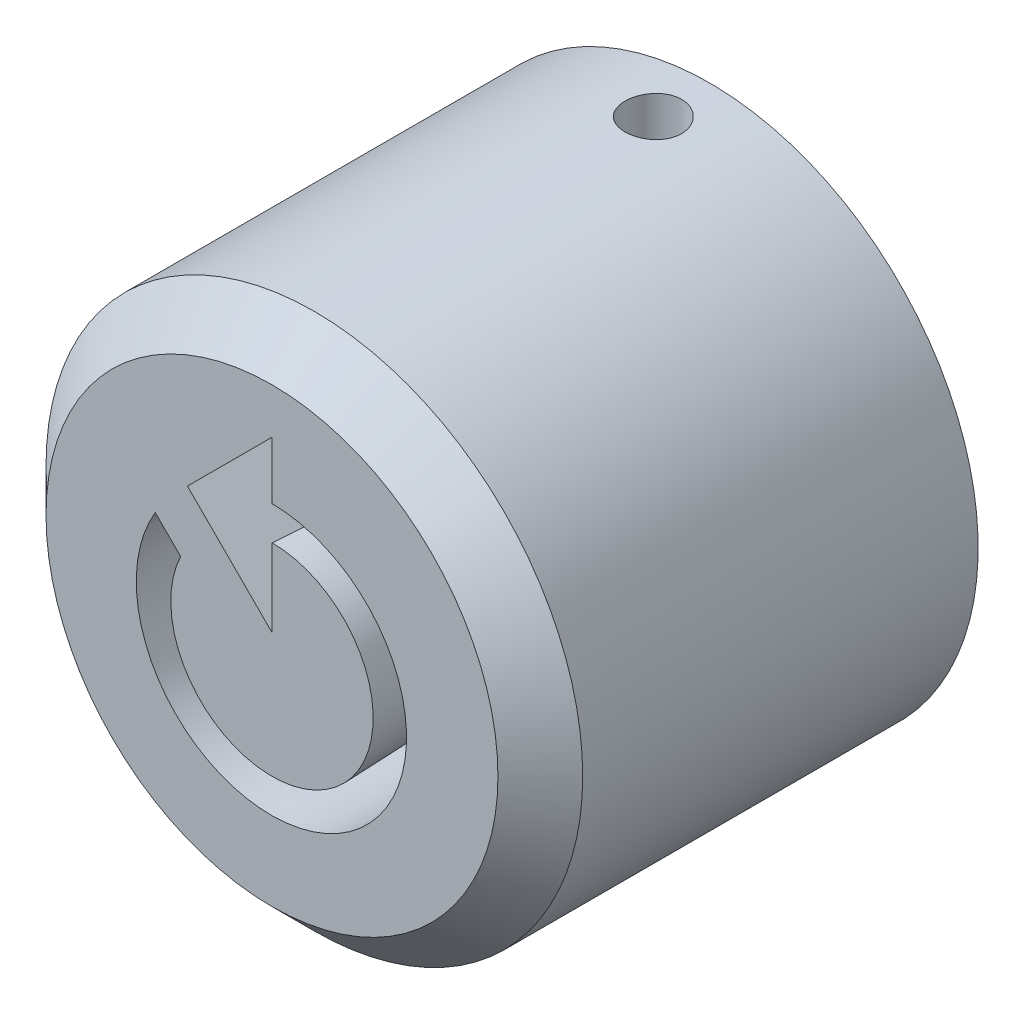
ISO-10303-21;
HEADER;
FILE_DESCRIPTION(('STEP AP214'),'2;1');
FILE_NAME('part.step','',(''),(''),'','','');
FILE_SCHEMA(('AUTOMOTIVE_DESIGN { 1 0 10303 214 1 1 1 1 }'));
ENDSEC;
DATA;
#1=APPLICATION_CONTEXT('core data for automotive mechanical design processes');
#2=APPLICATION_PROTOCOL_DEFINITION('international standard','automotive_design',2000,#1);
#3=PRODUCT_CONTEXT('',#1,'mechanical');
#4=PRODUCT('Part','Part','',(#3));
#5=PRODUCT_RELATED_PRODUCT_CATEGORY('part','',(#4));
#6=PRODUCT_DEFINITION_FORMATION('','',#4);
#7=PRODUCT_DEFINITION_CONTEXT('part definition',#1,'design');
#8=PRODUCT_DEFINITION('design','',#6,#7);
#9=PRODUCT_DEFINITION_SHAPE('','',#8);
#10=(LENGTH_UNIT() NAMED_UNIT(*) SI_UNIT(.MILLI.,.METRE.));
#11=(NAMED_UNIT(*) PLANE_ANGLE_UNIT() SI_UNIT($,.RADIAN.));
#12=(NAMED_UNIT(*) SI_UNIT($,.STERADIAN.) SOLID_ANGLE_UNIT());
#13=UNCERTAINTY_MEASURE_WITH_UNIT(LENGTH_MEASURE(1.E-05),#10,'distance_accuracy_value','');
#14=(GEOMETRIC_REPRESENTATION_CONTEXT(3) GLOBAL_UNCERTAINTY_ASSIGNED_CONTEXT((#13)) GLOBAL_UNIT_ASSIGNED_CONTEXT((#10,
#11,#12)) REPRESENTATION_CONTEXT('',''));
#15=CARTESIAN_POINT('',(0.,0.,0.));
#16=DIRECTION('',(0.,0.,1.));
#17=DIRECTION('',(1.,0.,0.));
#18=AXIS2_PLACEMENT_3D('',#15,#16,#17);
#19=CARTESIAN_POINT('',(-0.52868972236023,-0.528935712543339,7.75));
#20=DIRECTION('',(-0.706511647901726,-0.706840375551015,-0.0348994967025009));
#21=DIRECTION('',(0.707271226072109,-0.706942298048756,0.));
#22=AXIS2_PLACEMENT_3D('',#19,#20,#21);
#23=PLANE('',#22);
#24=CARTESIAN_POINT('',(-2.06629508801716,1.00795456465108,7.75));
#25=CARTESIAN_POINT('',(-2.09192062760297,1.21234922911868,4.12904064150296));
#26=CARTESIAN_POINT('',(-2.10500318028833,1.42929271652146,0.));
#27=B_SPLINE_CURVE_WITH_KNOTS('',2,(#24,#25,#26),.UNSPECIFIED.,.F.,.F.,(3,3),(0.,1.),.UNSPECIFIED.);
#28=CARTESIAN_POINT('',(-2.06629508801841,1.00795456465234,7.74999999999363));
#29=VERTEX_POINT('',#28);
#30=CARTESIAN_POINT('',(-2.10500318029031,1.42929271652343,0.));
#31=VERTEX_POINT('',#30);
#32=EDGE_CURVE('E124',#29,#31,#27,.T.);
#33=ORIENTED_EDGE('',*,*,#32,.T.);
#34=DIRECTION('',(0.707271226072109,-0.706942298048756,0.));
#35=VECTOR('',#34,1.);
#36=CARTESIAN_POINT('',(-0.337365712345746,-0.337522682776313,0.));
#37=LINE('',#36,#35);
#38=CARTESIAN_POINT('',(-1.28116608095946,0.605838756077155,0.));
#39=VERTEX_POINT('',#38);
#40=EDGE_CURVE('E110',#31,#39,#37,.T.);
#41=ORIENTED_EDGE('',*,*,#40,.T.);
#42=CARTESIAN_POINT('',(-1.6164705882346,0.558339263091638,7.74999999999492));
#43=CARTESIAN_POINT('',(-1.59218208177448,0.562516200801567,7.17370111765858));
#44=CARTESIAN_POINT('',(-1.56776740878335,0.566566813974001,6.59740662391816));
#45=CARTESIAN_POINT('',(-1.5186633573595,0.574392959084058,5.44482783512599));
#46=CARTESIAN_POINT('',(-1.49397397909784,0.578168491192965,4.86854354006811));
#47=CARTESIAN_POINT('',(-1.43830209697928,0.586297572042159,3.57686887432792));
#48=CARTESIAN_POINT('',(-1.40723921232807,0.590570631736887,2.86148145325106));
#49=CARTESIAN_POINT('',(-1.34460080538816,0.598603412829164,1.43072563064751));
#50=CARTESIAN_POINT('',(-1.31302528270274,0.602363133829417,0.715357229135969));
#51=CARTESIAN_POINT('',(-1.28116608095946,0.605838756077157,0.));
#52=B_SPLINE_CURVE_WITH_KNOTS('',3,(#42,#43,#44,#45,#46,#47,#48,#49,#50,#51),.UNSPECIFIED.,.F.,
.F.,(4,2,2,2,4),(0.,1.7304768057952,3.46095253407857,5.60917490813668,7.75739894479559),.UNSPECIFIED.);
#53=CARTESIAN_POINT('',(-1.61647058823465,0.558339263091434,7.74999999999363));
#54=VERTEX_POINT('',#53);
#55=EDGE_CURVE('E103',#54,#39,#52,.T.);
#56=ORIENTED_EDGE('',*,*,#55,.F.);
#57=DIRECTION('',(0.707271226072109,-0.706942298048756,0.));
#58=VECTOR('',#57,1.);
#59=CARTESIAN_POINT('',(-0.52868972236023,-0.528935712543339,7.75));
#60=LINE('',#59,#58);
#61=EDGE_CURVE('E135',#54,#29,#60,.F.);
#62=ORIENTED_EDGE('',*,*,#61,.T.);
#63=EDGE_LOOP('',(#33,#41,#56,#62));
#64=FACE_BOUND('',#63,.T.);
#65=ADVANCED_FACE('F17',(#64),#23,.T.);
#66=CARTESIAN_POINT('',(0.,19.0707581171369,1.));
#67=DIRECTION('',(0.,-1.,0.));
#68=DIRECTION('',(0.,0.,-1.));
#69=AXIS2_PLACEMENT_3D('',#66,#67,#68);
#70=CYLINDRICAL_SURFACE('',#69,0.5);
#71=CARTESIAN_POINT('',(0.,0.,1.));
#72=DIRECTION('',(0.,-1.,0.));
#73=DIRECTION('',(0.,0.,-1.));
#74=AXIS2_PLACEMENT_3D('',#71,#72,#73);
#75=CIRCLE('',#74,0.5);
#76=CARTESIAN_POINT('',(0.254278491846928,0.,0.5694858323074));
#77=VERTEX_POINT('',#76);
#78=CARTESIAN_POINT('',(0.223627931985657,0.,1.44720302775793));
#79=VERTEX_POINT('',#78);
#80=EDGE_CURVE('E21',#77,#79,#75,.T.);
#81=ORIENTED_EDGE('',*,*,#80,.T.);
#82=DIRECTION('',(0.,1.,0.));
#83=VECTOR('',#82,1.);
#84=CARTESIAN_POINT('',(0.223627931985655,0.,1.44720302775797));
#85=LINE('',#84,#83);
#86=CARTESIAN_POINT('',(0.223627931986733,1.34224395970398,1.44720302775771));
#87=VERTEX_POINT('',#86);
#88=EDGE_CURVE('E113',#87,#79,#85,.F.);
#89=ORIENTED_EDGE('',*,*,#88,.F.);
#90=CARTESIAN_POINT('',(0.254278491849068,1.30645754482282,0.569485832308664));
#91=CARTESIAN_POINT('',(0.278667429265234,1.30289349994388,0.583872700750701));
#92=CARTESIAN_POINT('',(0.301772155658622,1.29899898522769,0.600329868723842));
#93=CARTESIAN_POINT('',(0.344884978732647,1.29105372198719,0.636889333162118));
#94=CARTESIAN_POINT('',(0.364891319343464,1.28700288647784,0.656993682824281));
#95=CARTESIAN_POINT('',(0.401259920447106,1.27925282867018,0.70034600321787));
#96=CARTESIAN_POINT('',(0.417620266203169,1.27555379170474,0.723595615469751));
#97=CARTESIAN_POINT('',(0.446203867584063,1.26902198368975,0.772610907936497));
#98=CARTESIAN_POINT('',(0.458429677670819,1.26618867786575,0.79837502187621));
#99=CARTESIAN_POINT('',(0.478185683498803,1.26185994633733,0.851265318158901));
#100=CARTESIAN_POINT('',(0.485790426341684,1.26034310160132,0.878361806708653));
#101=CARTESIAN_POINT('',(0.496350072133742,1.25885046392663,0.93348920603784));
#102=CARTESIAN_POINT('',(0.499305664134467,1.25887444260018,0.961519977718002));
#103=CARTESIAN_POINT('',(0.500451402088437,1.26050923112215,1.01640610812182));
#104=CARTESIAN_POINT('',(0.498843064849056,1.26205103447842,1.04325960853596));
#105=CARTESIAN_POINT('',(0.491377990007465,1.26650510510505,1.09624760463344));
#106=CARTESIAN_POINT('',(0.485521409013351,1.26941732185484,1.12238212678447));
#107=CARTESIAN_POINT('',(0.469740961979443,1.27636188238411,1.17337761447969));
#108=CARTESIAN_POINT('',(0.459796469372507,1.28039987279,1.19823139138769));
#109=CARTESIAN_POINT('',(0.436142319225752,1.28921546521452,1.24594614915328));
#110=CARTESIAN_POINT('',(0.422430494953527,1.29399349216363,1.26880597321612));
#111=CARTESIAN_POINT('',(0.390792743382608,1.30411655184093,1.31314756525043));
#112=CARTESIAN_POINT('',(0.372684264791615,1.30947816138169,1.33449519367615));
#113=CARTESIAN_POINT('',(0.333150236057103,1.32002372691148,1.37388158549519));
#114=CARTESIAN_POINT('',(0.311728782970256,1.32520789279698,1.39192437648137));
#115=CARTESIAN_POINT('',(0.278572898755345,1.33225268917277,1.41540170779116));
#116=CARTESIAN_POINT('',(0.267934822717999,1.33438259103107,1.42234182344411));
#117=CARTESIAN_POINT('',(0.246152368491054,1.33845936386926,1.43539610906682));
#118=CARTESIAN_POINT('',(0.235008773151065,1.3404065044262,1.44151150153307));
#119=CARTESIAN_POINT('',(0.223627931987809,1.34224395970479,1.44720302775745));
#120=B_SPLINE_CURVE_WITH_KNOTS('',3,(#90,#91,#92,#93,#94,#95,#96,#97,#98,#99,#100,#101,#102,
#103,#104,#105,#106,#107,#108,#109,#110,#111,#112,#113,#114,#115,#116,#117,#118,#119),
.UNSPECIFIED.,.F.,.F.,(4,2,2,2,2,2,2,2,2,2,2,2,2,2,4),(0.,0.0855006247958221,0.171049532759484,
0.256643262410861,0.342184012209441,0.426305406751942,0.510414332471131,0.590868015605615,
0.671318733030357,0.752180466658459,0.83308880457947,0.918218744766181,1.00324423692253,
1.04184958772311,1.08039706918053),.UNSPECIFIED.);
#121=CARTESIAN_POINT('',(0.254278491847923,1.30645754482306,0.569485832310194));
#122=VERTEX_POINT('',#121);
#123=EDGE_CURVE('E97',#122,#87,#120,.T.);
#124=ORIENTED_EDGE('',*,*,#123,.F.);
#125=DIRECTION('',(0.,1.,0.));
#126=VECTOR('',#125,1.);
#127=CARTESIAN_POINT('',(0.254278491846928,0.,0.5694858323074));
#128=LINE('',#127,#126);
#129=EDGE_CURVE('E92',#77,#122,#128,.T.);
#130=ORIENTED_EDGE('',*,*,#129,.F.);
#131=EDGE_LOOP('',(#81,#89,#124,#130));
#132=FACE_BOUND('',#131,.T.);
#133=ADVANCED_FACE('F94',(#132),#70,.F.);
#134=CARTESIAN_POINT('',(0.,0.,1.));
#135=DIRECTION('',(0.,-1.,0.));
#136=DIRECTION('',(0.,0.,-1.));
#137=AXIS2_PLACEMENT_3D('',#134,#135,#136);
#138=PLANE('',#137);
#139=ORIENTED_EDGE('',*,*,#80,.F.);
#140=DIRECTION('',(-0.0348994967025009,0.,0.999390827019096));
#141=VECTOR('',#140,1.);
#142=CARTESIAN_POINT('',(0.00352941176470608,0.,7.75));
#143=LINE('',#142,#141);
#144=EDGE_CURVE('E107',#79,#77,#143,.F.);
#145=ORIENTED_EDGE('',*,*,#144,.F.);
#146=EDGE_LOOP('',(#139,#145));
#147=FACE_BOUND('',#146,.T.);
#148=ADVANCED_FACE('F106',(#147),#138,.F.);
#149=CARTESIAN_POINT('',(0.,19.0707581171369,1.));
#150=DIRECTION('',(0.,-1.,0.));
#151=DIRECTION('',(0.,0.,-1.));
#152=AXIS2_PLACEMENT_3D('',#149,#150,#151);
#153=CYLINDRICAL_SURFACE('',#152,0.5);
#154=CARTESIAN_POINT('',(0.,0.,1.));
#155=DIRECTION('',(0.,-1.,0.));
#156=DIRECTION('',(0.,0.,-1.));
#157=AXIS2_PLACEMENT_3D('',#154,#155,#156);
#158=CIRCLE('',#157,0.5);
#159=CARTESIAN_POINT('',(-0.107356942752589,0.,1.48833849617127));
#160=VERTEX_POINT('',#159);
#161=CARTESIAN_POINT('',(-0.154955734579308,0.,0.524617290679407));
#162=VERTEX_POINT('',#161);
#163=EDGE_CURVE('E109',#160,#162,#158,.T.);
#164=ORIENTED_EDGE('',*,*,#163,.T.);
#165=CARTESIAN_POINT('',(0.,-0.131448614777572,1.));
#166=DIRECTION('',(0.706601654000678,0.706750399853738,-0.0348994967025009));
#167=DIRECTION('',(0.705889938423281,-0.707462982993868,-0.0348643446259301));
#168=AXIS2_PLACEMENT_3D('',#165,#166,#167);
#169=ELLIPSE('',#168,0.707463342225876,0.5);
#170=EDGE_CURVE('E114',#160,#162,#169,.F.);
#171=ORIENTED_EDGE('',*,*,#170,.F.);
#172=EDGE_LOOP('',(#164,#171));
#173=FACE_BOUND('',#172,.T.);
#174=ADVANCED_FACE('F435',(#173),#153,.F.);
#175=CARTESIAN_POINT('',(0.,0.,1.));
#176=DIRECTION('',(0.,-1.,0.));
#177=DIRECTION('',(0.,0.,-1.));
#178=AXIS2_PLACEMENT_3D('',#175,#176,#177);
#179=PLANE('',#178);
#180=ORIENTED_EDGE('',*,*,#163,.F.);
#181=DIRECTION('',(0.0493304915471502,0.,0.998782510161104));
#182=VECTOR('',#181,1.);
#183=CARTESIAN_POINT('',(-0.154955734579307,0.,0.524617290679409));
#184=LINE('',#183,#182);
#185=EDGE_CURVE('E117',#162,#160,#184,.T.);
#186=ORIENTED_EDGE('',*,*,#185,.F.);
#187=EDGE_LOOP('',(#180,#186));
#188=FACE_BOUND('',#187,.T.);
#189=ADVANCED_FACE('F427',(#188),#179,.F.);
#190=CARTESIAN_POINT('',(0.00334204702841537,0.,7.75));
#191=DIRECTION('',(-0.999390827019096,0.,-0.0348994967025009));
#192=DIRECTION('',(-0.0348994967025009,0.,0.999390827019096));
#193=AXIS2_PLACEMENT_3D('',#190,#191,#192);
#194=PLANE('',#193);
#195=CARTESIAN_POINT('',(0.223437239058528,2.38741244755919,1.44729833467374));
#196=CARTESIAN_POINT('',(0.108768641537139,2.28258517635298,4.73097733689296));
#197=CARTESIAN_POINT('',(0.00334204702841585,2.17775790514684,7.75));
#198=B_SPLINE_CURVE_WITH_KNOTS('',2,(#195,#196,#197),.UNSPECIFIED.,.F.,.F.,(3,3),(0.,1.),.UNSPECIFIED.);
#199=CARTESIAN_POINT('',(0.223437239060292,2.3874124475616,1.44729833467286));
#200=VERTEX_POINT('',#199);
#201=CARTESIAN_POINT('',(0.00334204702841597,2.17775790514856,7.74999999999363));
#202=VERTEX_POINT('',#201);
#203=EDGE_CURVE('E160',#200,#202,#198,.T.);
#204=ORIENTED_EDGE('',*,*,#203,.T.);
#205=DIRECTION('',(0.,1.,0.));
#206=VECTOR('',#205,1.);
#207=CARTESIAN_POINT('',(0.00334204702841608,0.,7.75));
#208=LINE('',#207,#206);
#209=CARTESIAN_POINT('',(0.00334204702841679,3.19775790514684,7.75));
#210=VERTEX_POINT('',#209);
#211=EDGE_CURVE('E245',#210,#202,#208,.F.);
#212=ORIENTED_EDGE('',*,*,#211,.F.);
#213=DIRECTION('',(-0.0347762787171803,-0.0839573637278828,0.995862325582432));
#214=VECTOR('',#213,1.);
#215=CARTESIAN_POINT('',(0.223437239058533,3.72911470275905,1.44729833467374));
#216=LINE('',#215,#214);
#217=CARTESIAN_POINT('',(0.223437239058531,3.72911470275905,1.44729833467374));
#218=VERTEX_POINT('',#217);
#219=EDGE_CURVE('E189',#218,#210,#216,.T.);
#220=ORIENTED_EDGE('',*,*,#219,.F.);
#221=DIRECTION('',(0.,1.,0.));
#222=VECTOR('',#221,1.);
#223=CARTESIAN_POINT('',(0.223437239058528,0.,1.44729833467374));
#224=LINE('',#223,#222);
#225=EDGE_CURVE('E36',#218,#200,#224,.F.);
#226=ORIENTED_EDGE('',*,*,#225,.T.);
#227=EDGE_LOOP('',(#204,#212,#220,#226));
#228=FACE_BOUND('',#227,.T.);
#229=ADVANCED_FACE('F172',(#228),#194,.T.);
#230=CARTESIAN_POINT('',(-0.0102924476809878,-0.213841015526033,5.6843418860808E-11));
#231=DIRECTION('',(0.,0.,-1.));
#232=DIRECTION('',(-1.,0.,0.));
#233=AXIS2_PLACEMENT_3D('',#230,#231,#232);
#234=CONICAL_SURFACE('',#233,2.66227374901825,0.0349065850402135);
#235=CARTESIAN_POINT('',(0.254094871444858,2.4152895818073,0.569377431727712));
#236=CARTESIAN_POINT('',(0.278506549375255,2.41233487672303,0.583759045956063));
#237=CARTESIAN_POINT('',(0.301637412372597,2.40908084648447,0.60022528988083));
#238=CARTESIAN_POINT('',(0.34476969580144,2.40230022080723,0.63678201318293));
#239=CARTESIAN_POINT('',(0.364772537812557,2.39877375027849,0.656870837230129));
#240=CARTESIAN_POINT('',(0.401109341438213,2.39177006012126,0.70014786605757));
#241=CARTESIAN_POINT('',(0.417442270415014,2.38829285461216,0.723336940263912));
#242=CARTESIAN_POINT('',(0.445975918159442,2.3817101197951,0.772174177877493));
#243=CARTESIAN_POINT('',(0.45817759533091,2.37860450439067,0.797821769162531));
#244=CARTESIAN_POINT('',(0.478064597125857,2.37304869609541,0.850822911786097));
#245=CARTESIAN_POINT('',(0.485758818210882,2.37059721736705,0.878172983998591));
#246=CARTESIAN_POINT('',(0.49641359688084,2.36654838480566,0.933844710883128));
#247=CARTESIAN_POINT('',(0.499374163070338,2.36495102942006,0.962166363788991));
#248=CARTESIAN_POINT('',(0.500436892292441,2.36273927892716,1.01838748694821));
#249=CARTESIAN_POINT('',(0.498632161127439,2.36210642197446,1.04628449311119));
#250=CARTESIAN_POINT('',(0.490403731227223,2.36175799553987,1.10139083885165));
#251=CARTESIAN_POINT('',(0.483980686985098,2.36204229610114,1.12860027530387));
#252=CARTESIAN_POINT('',(0.466783966200434,2.36341010874136,1.1813136367311));
#253=CARTESIAN_POINT('',(0.456049729593966,2.36448644739593,1.20683064301765));
#254=CARTESIAN_POINT('',(0.430537732376435,2.36723803460051,1.25573035009747));
#255=CARTESIAN_POINT('',(0.415758504879026,2.36891350048734,1.27911227250794));
#256=CARTESIAN_POINT('',(0.3823688489163,2.37263808689404,1.32337660827142));
#257=CARTESIAN_POINT('',(0.363713833083126,2.37469152107846,1.34422500634758));
#258=CARTESIAN_POINT('',(0.323218740410589,2.3788708430051,1.38249615377422));
#259=CARTESIAN_POINT('',(0.301382807562521,2.38099663376367,1.39992329191739));
#260=CARTESIAN_POINT('',(0.260682955533773,2.38456354219102,1.42719489021343));
#261=CARTESIAN_POINT('',(0.242364795882774,2.3860464780115,1.43785525475898));
#262=CARTESIAN_POINT('',(0.223437239062062,2.38741244756402,1.44729833467199));
#263=B_SPLINE_CURVE_WITH_KNOTS('',3,(#235,#236,#237,#238,#239,#240,#241,#242,#243,#244,#245,
#246,#247,#248,#249,#250,#251,#252,#253,#254,#255,#256,#257,#258,#259,#260,#261,#262),
.UNSPECIFIED.,.F.,.F.,(4,2,2,2,2,2,2,2,2,2,2,2,2,4),(0.,0.0853383907859752,0.170637884739307,
0.255961350235532,0.341265008065434,0.426399728016077,0.511534293213514,0.595017839754961,
0.678489557596875,0.761214441421077,0.843969364659401,0.927735005757518,1.01139247987899,
1.07495776173753),.UNSPECIFIED.);
#264=CARTESIAN_POINT('',(0.254094891970935,2.41528957972043,0.569377432376052));
#265=VERTEX_POINT('',#264);
#266=EDGE_CURVE('E128',#265,#200,#263,.T.);
#267=ORIENTED_EDGE('',*,*,#266,.F.);
#268=CARTESIAN_POINT('',(0.273978010589455,2.4332124069188,1.35185307175451E-13));
#269=CARTESIAN_POINT('',(0.270664149778012,2.43023540574384,0.0948965575409736));
#270=CARTESIAN_POINT('',(0.26735029453127,2.42725333604928,0.189792955729574));
#271=CARTESIAN_POINT('',(0.260722595167123,2.42127905962086,0.379585433404326));
#272=CARTESIAN_POINT('',(0.257408751049716,2.41828685288701,0.474481512890478));
#273=CARTESIAN_POINT('',(0.254094912497012,2.41528957763355,0.569377433024392));
#274=B_SPLINE_CURVE_WITH_KNOTS('',3,(#268,#269,#270,#271,#272,#273),.UNSPECIFIED.,.F.,.F.,(4,2,
4),(0.,0.285003169962829,0.570006339931746),.UNSPECIFIED.);
#275=CARTESIAN_POINT('',(0.273978010589458,2.43321240691881,0.));
#276=VERTEX_POINT('',#275);
#277=EDGE_CURVE('E180',#276,#265,#274,.T.);
#278=ORIENTED_EDGE('',*,*,#277,.F.);
#279=CARTESIAN_POINT('',(-0.0102924476809878,-0.213841015526033,0.));
#280=DIRECTION('',(0.,0.,-1.));
#281=DIRECTION('',(-1.,0.,0.));
#282=AXIS2_PLACEMENT_3D('',#279,#280,#281);
#283=CIRCLE('',#282,2.66227374902023);
#284=EDGE_CURVE('E191',#276,#31,#283,.T.);
#285=ORIENTED_EDGE('',*,*,#284,.T.);
#286=ORIENTED_EDGE('',*,*,#32,.F.);
#287=CARTESIAN_POINT('',(-0.0102924476809878,-0.213841015526033,7.74999999998727));
#288=DIRECTION('',(0.,0.,-1.));
#289=DIRECTION('',(-1.,0.,0.));
#290=AXIS2_PLACEMENT_3D('',#287,#288,#289);
#291=CIRCLE('',#290,2.39163778545709);
#292=EDGE_CURVE('E272',#202,#29,#291,.T.);
#293=ORIENTED_EDGE('',*,*,#292,.F.);
#294=ORIENTED_EDGE('',*,*,#203,.F.);
#295=EDGE_LOOP('',(#267,#278,#285,#286,#293,#294));
#296=FACE_BOUND('',#295,.T.);
#297=ADVANCED_FACE('F167',(#296),#234,.F.);
#298=CARTESIAN_POINT('',(0.,-0.212525788811035,7.74999999998727));
#299=DIRECTION('',(0.,0.,1.));
#300=DIRECTION('',(1.,0.,0.));
#301=AXIS2_PLACEMENT_3D('',#298,#299,#300);
#302=CONICAL_SURFACE('',#301,1.7908685297563,0.0349065850394999);
#303=CARTESIAN_POINT('',(0.,-0.212525788811035,0.));
#304=DIRECTION('',(0.,0.,1.));
#305=DIRECTION('',(1.,0.,0.));
#306=AXIS2_PLACEMENT_3D('',#303,#304,#305);
#307=CIRCLE('',#306,1.5202325661987);
#308=CARTESIAN_POINT('',(0.274165375325425,1.28278033446398,0.));
#309=VERTEX_POINT('',#308);
#310=EDGE_CURVE('E322',#39,#309,#307,.T.);
#311=ORIENTED_EDGE('',*,*,#310,.T.);
#312=CARTESIAN_POINT('',(0.254278491846778,1.30645754482331,0.569485832311723));
#313=CARTESIAN_POINT('',(0.257593017297614,1.302542286582,0.474570241988906));
#314=CARTESIAN_POINT('',(0.260907520312661,1.29861155659841,0.379655294143035));
#315=CARTESIAN_POINT('',(0.26753648147232,1.29071915314529,0.189826683372449));
#316=CARTESIAN_POINT('',(0.270850939616931,1.28675747967575,0.0949130204477344));
#317=CARTESIAN_POINT('',(0.274165375325753,1.28278033446392,0.));
#318=B_SPLINE_CURVE_WITH_KNOTS('',3,(#312,#313,#314,#315,#316,#317),.UNSPECIFIED.,.F.,.F.,(4,2,
4),(0.,0.285162331027829,0.570324662154018),.UNSPECIFIED.);
#319=EDGE_CURVE('E102',#122,#309,#318,.T.);
#320=ORIENTED_EDGE('',*,*,#319,.F.);
#321=ORIENTED_EDGE('',*,*,#123,.T.);
#322=CARTESIAN_POINT('',(0.00352941176470786,1.57833926309208,7.75));
#323=CARTESIAN_POINT('',(0.121344646048475,1.46029161139768,4.37621311046398));
#324=CARTESIAN_POINT('',(0.223627931985657,1.34224395970316,1.44720302775797));
#325=B_SPLINE_CURVE_WITH_KNOTS('',2,(#322,#323,#324),.UNSPECIFIED.,.F.,.F.,(3,3),(0.,1.),.UNSPECIFIED.);
#326=CARTESIAN_POINT('',(0.00352941176470786,1.57833926309154,7.74999999999363));
#327=VERTEX_POINT('',#326);
#328=EDGE_CURVE('E119',#327,#87,#325,.T.);
#329=ORIENTED_EDGE('',*,*,#328,.F.);
#330=CARTESIAN_POINT('',(0.,-0.212525788811035,7.74999999998727));
#331=DIRECTION('',(0.,0.,1.));
#332=DIRECTION('',(1.,0.,0.));
#333=AXIS2_PLACEMENT_3D('',#330,#331,#332);
#334=CIRCLE('',#333,1.7908685297563);
#335=EDGE_CURVE('E193',#54,#327,#334,.T.);
#336=ORIENTED_EDGE('',*,*,#335,.F.);
#337=ORIENTED_EDGE('',*,*,#55,.T.);
#338=EDGE_LOOP('',(#311,#320,#321,#329,#336,#337));
#339=FACE_BOUND('',#338,.T.);
#340=ADVANCED_FACE('F171',(#339),#302,.T.);
#341=CARTESIAN_POINT('',(0.00352941176470608,0.,7.75));
#342=DIRECTION('',(-0.999390827019096,0.,-0.0348994967025009));
#343=DIRECTION('',(-0.0348994967025009,0.,0.999390827019096));
#344=AXIS2_PLACEMENT_3D('',#341,#342,#343);
#345=PLANE('',#344);
#346=ORIENTED_EDGE('',*,*,#88,.T.);
#347=ORIENTED_EDGE('',*,*,#144,.T.);
#348=ORIENTED_EDGE('',*,*,#129,.T.);
#349=ORIENTED_EDGE('',*,*,#319,.T.);
#350=DIRECTION('',(0.,1.,0.));
#351=VECTOR('',#350,1.);
#352=CARTESIAN_POINT('',(0.274165375325097,0.,0.));
#353=LINE('',#352,#351);
#354=CARTESIAN_POINT('',(0.274165375325314,-0.454936517188943,0.));
#355=VERTEX_POINT('',#354);
#356=EDGE_CURVE('E286',#309,#355,#353,.F.);
#357=ORIENTED_EDGE('',*,*,#356,.T.);
#358=DIRECTION('',(0.0347763151945401,-0.0839449574442928,-0.995863370157355));
#359=VECTOR('',#358,1.);
#360=CARTESIAN_POINT('',(0.00352941176470581,0.198339263092078,7.75));
#361=LINE('',#360,#359);
#362=CARTESIAN_POINT('',(0.00352941176470718,0.198339263092077,7.75));
#363=VERTEX_POINT('',#362);
#364=EDGE_CURVE('E246',#363,#355,#361,.T.);
#365=ORIENTED_EDGE('',*,*,#364,.F.);
#366=DIRECTION('',(0.,1.,0.));
#367=VECTOR('',#366,1.);
#368=CARTESIAN_POINT('',(0.00352941176470786,0.,7.75));
#369=LINE('',#368,#367);
#370=EDGE_CURVE('E190',#327,#363,#369,.F.);
#371=ORIENTED_EDGE('',*,*,#370,.F.);
#372=ORIENTED_EDGE('',*,*,#328,.T.);
#373=EDGE_LOOP('',(#346,#347,#348,#349,#357,#365,#371,#372));
#374=FACE_BOUND('',#373,.T.);
#375=ADVANCED_FACE('F111',(#374),#345,.T.);
#376=CARTESIAN_POINT('',(0.100933963784572,0.10095521127028,7.75));
#377=DIRECTION('',(0.706601654000678,0.706750399853738,-0.0348994967025009));
#378=DIRECTION('',(-0.707181195530659,0.707032359010412,0.));
#379=AXIS2_PLACEMENT_3D('',#376,#377,#378);
#380=PLANE('',#379);
#381=ORIENTED_EDGE('',*,*,#364,.T.);
#382=DIRECTION('',(-0.707181195530659,0.707032359010412,0.));
#383=VECTOR('',#382,1.);
#384=CARTESIAN_POINT('',(0.274165375325751,-0.454936517189381,0.));
#385=LINE('',#384,#383);
#386=CARTESIAN_POINT('',(-1.87918862731965,1.69796428093271,0.));
#387=VERTEX_POINT('',#386);
#388=EDGE_CURVE('E279',#355,#387,#385,.T.);
#389=ORIENTED_EDGE('',*,*,#388,.T.);
#390=DIRECTION('',(-0.0493279016025006,-2.59571589576409E-06,-0.998782638073348));
#391=VECTOR('',#390,1.);
#392=CARTESIAN_POINT('',(-1.49643143586825,1.69798442225017,7.75));
#393=LINE('',#392,#391);
#394=CARTESIAN_POINT('',(-1.49643143586825,1.69798442225018,7.75));
#395=VERTEX_POINT('',#394);
#396=EDGE_CURVE('E251',#395,#387,#393,.T.);
#397=ORIENTED_EDGE('',*,*,#396,.F.);
#398=DIRECTION('',(-0.707181195530657,0.707032359010414,0.));
#399=VECTOR('',#398,1.);
#400=CARTESIAN_POINT('',(0.0035294117647063,0.198339263092078,7.75));
#401=LINE('',#400,#399);
#402=EDGE_CURVE('E242',#363,#395,#401,.T.);
#403=ORIENTED_EDGE('',*,*,#402,.F.);
#404=EDGE_LOOP('',(#381,#389,#397,#403));
#405=FACE_BOUND('',#404,.T.);
#406=ORIENTED_EDGE('',*,*,#170,.T.);
#407=ORIENTED_EDGE('',*,*,#185,.T.);
#408=EDGE_LOOP('',(#406,#407));
#409=FACE_BOUND('',#408,.T.);
#410=ADVANCED_FACE('F205',(#405,#409),#380,.T.);
#411=CARTESIAN_POINT('',(0.,0.,7.75));
#412=DIRECTION('',(0.,0.,1.));
#413=DIRECTION('',(1.,0.,0.));
#414=AXIS2_PLACEMENT_3D('',#411,#412,#413);
#415=PLANE('',#414);
#416=ORIENTED_EDGE('',*,*,#335,.T.);
#417=ORIENTED_EDGE('',*,*,#370,.T.);
#418=ORIENTED_EDGE('',*,*,#402,.T.);
#419=DIRECTION('',(0.707106781186547,0.707106781186547,0.));
#420=VECTOR('',#419,1.);
#421=CARTESIAN_POINT('',(-1.59720792905921,1.59720792905921,7.75));
#422=LINE('',#421,#420);
#423=EDGE_CURVE('E249',#210,#395,#422,.F.);
#424=ORIENTED_EDGE('',*,*,#423,.F.);
#425=ORIENTED_EDGE('',*,*,#211,.T.);
#426=ORIENTED_EDGE('',*,*,#292,.T.);
#427=ORIENTED_EDGE('',*,*,#61,.F.);
#428=EDGE_LOOP('',(#416,#417,#418,#424,#425,#426,#427));
#429=FACE_BOUND('',#428,.T.);
#430=CARTESIAN_POINT('',(0.,0.,7.74999999993042));
#431=DIRECTION('',(0.,0.,-1.));
#432=DIRECTION('',(0.,1.,0.));
#433=AXIS2_PLACEMENT_3D('',#430,#431,#432);
#434=CIRCLE('',#433,4.0000000000191);
#435=CARTESIAN_POINT('',(0.,4.0000000000191,7.74999999993042));
#436=VERTEX_POINT('',#435);
#437=EDGE_CURVE('E327',#436,#436,#434,.T.);
#438=ORIENTED_EDGE('',*,*,#437,.F.);
#439=EDGE_LOOP('',(#438));
#440=FACE_BOUND('',#439,.T.);
#441=ADVANCED_FACE('F201',(#429,#440),#415,.T.);
#442=CARTESIAN_POINT('',(0.00334204702841537,0.,7.75));
#443=DIRECTION('',(-0.999390827019096,0.,-0.0348994967025009));
#444=DIRECTION('',(-0.0348994967025009,0.,0.999390827019096));
#445=AXIS2_PLACEMENT_3D('',#442,#443,#444);
#446=PLANE('',#445);
#447=DIRECTION('',(-0.0347762787171862,-0.0839573637278893,0.995862325582431));
#448=VECTOR('',#447,1.);
#449=CARTESIAN_POINT('',(0.273978010589465,3.85113091884183,0.));
#450=LINE('',#449,#448);
#451=CARTESIAN_POINT('',(0.273978010589462,3.85113091884183,0.));
#452=VERTEX_POINT('',#451);
#453=CARTESIAN_POINT('',(0.254094911712546,3.80312887187119,0.569377455488227));
#454=VERTEX_POINT('',#453);
#455=EDGE_CURVE('E256',#452,#454,#450,.T.);
#456=ORIENTED_EDGE('',*,*,#455,.F.);
#457=DIRECTION('',(0.,1.,0.));
#458=VECTOR('',#457,1.);
#459=CARTESIAN_POINT('',(0.273978010589461,0.,0.));
#460=LINE('',#459,#458);
#461=EDGE_CURVE('E278',#452,#276,#460,.F.);
#462=ORIENTED_EDGE('',*,*,#461,.T.);
#463=ORIENTED_EDGE('',*,*,#277,.T.);
#464=DIRECTION('',(0.,-1.,0.));
#465=VECTOR('',#464,1.);
#466=CARTESIAN_POINT('',(0.254094911712532,19.0707581171369,0.569377455488219));
#467=LINE('',#466,#465);
#468=EDGE_CURVE('E330',#265,#454,#467,.F.);
#469=ORIENTED_EDGE('',*,*,#468,.T.);
#470=EDGE_LOOP('',(#456,#462,#463,#469));
#471=FACE_BOUND('',#470,.T.);
#472=ADVANCED_FACE('F195',(#471),#446,.T.);
#473=CARTESIAN_POINT('',(-1.59720792905921,1.59720792905921,7.75));
#474=DIRECTION('',(0.706676030840835,-0.706676030840835,-0.0348994967025009));
#475=DIRECTION('',(0.707106781186547,0.707106781186547,0.));
#476=AXIS2_PLACEMENT_3D('',#473,#474,#475);
#477=PLANE('',#476);
#478=DIRECTION('',(0.707106781186546,0.707106781186549,0.));
#479=VECTOR('',#478,1.);
#480=CARTESIAN_POINT('',(-1.87918862731965,1.69796428093271,0.));
#481=LINE('',#480,#479);
#482=EDGE_CURVE('E275',#387,#452,#481,.T.);
#483=ORIENTED_EDGE('',*,*,#482,.T.);
#484=ORIENTED_EDGE('',*,*,#455,.T.);
#485=CARTESIAN_POINT('',(0.,3.52776748242863,1.));
#486=DIRECTION('',(0.706676030840835,-0.706676030840835,-0.0348994967025009));
#487=DIRECTION('',(-0.705815840719937,-0.70753726929049,0.034857015847091));
#488=AXIS2_PLACEMENT_3D('',#485,#486,#487);
#489=ELLIPSE('',#488,0.707537794093678,0.5);
#490=EDGE_CURVE('E331',#454,#218,#489,.F.);
#491=ORIENTED_EDGE('',*,*,#490,.T.);
#492=ORIENTED_EDGE('',*,*,#219,.T.);
#493=ORIENTED_EDGE('',*,*,#423,.T.);
#494=ORIENTED_EDGE('',*,*,#396,.T.);
#495=EDGE_LOOP('',(#483,#484,#491,#492,#493,#494));
#496=FACE_BOUND('',#495,.T.);
#497=ADVANCED_FACE('F200',(#496),#477,.T.);
#498=CARTESIAN_POINT('',(0.,0.,0.));
#499=DIRECTION('',(0.,0.,1.));
#500=DIRECTION('',(1.,0.,0.));
#501=AXIS2_PLACEMENT_3D('',#498,#499,#500);
#502=PLANE('',#501);
#503=ORIENTED_EDGE('',*,*,#482,.F.);
#504=ORIENTED_EDGE('',*,*,#388,.F.);
#505=ORIENTED_EDGE('',*,*,#356,.F.);
#506=ORIENTED_EDGE('',*,*,#310,.F.);
#507=ORIENTED_EDGE('',*,*,#40,.F.);
#508=ORIENTED_EDGE('',*,*,#284,.F.);
#509=ORIENTED_EDGE('',*,*,#461,.F.);
#510=EDGE_LOOP('',(#503,#504,#505,#506,#507,#508,#509));
#511=FACE_BOUND('',#510,.T.);
#512=CARTESIAN_POINT('',(0.,0.,0.));
#513=DIRECTION('',(0.,0.,-1.));
#514=DIRECTION('',(-1.,0.,0.));
#515=AXIS2_PLACEMENT_3D('',#512,#513,#514);
#516=CIRCLE('',#515,4.75);
#517=CARTESIAN_POINT('',(-4.75,0.,0.));
#518=VERTEX_POINT('',#517);
#519=EDGE_CURVE('E333',#518,#518,#516,.F.);
#520=ORIENTED_EDGE('',*,*,#519,.F.);
#521=EDGE_LOOP('',(#520));
#522=FACE_BOUND('',#521,.T.);
#523=ADVANCED_FACE('F305',(#511,#522),#502,.F.);
#524=CARTESIAN_POINT('',(0.,0.,6.99999999994816));
#525=DIRECTION('',(0.,0.,-1.));
#526=DIRECTION('',(0.,1.,0.));
#527=AXIS2_PLACEMENT_3D('',#524,#525,#526);
#528=CONICAL_SURFACE('',#527,4.75000000000136,0.785398163397448);
#529=ORIENTED_EDGE('',*,*,#437,.T.);
#530=EDGE_LOOP('',(#529));
#531=FACE_BOUND('',#530,.T.);
#532=CARTESIAN_POINT('',(0.,0.,7.));
#533=DIRECTION('',(0.,0.,-1.));
#534=DIRECTION('',(-1.,0.,0.));
#535=AXIS2_PLACEMENT_3D('',#532,#533,#534);
#536=CIRCLE('',#535,4.75);
#537=CARTESIAN_POINT('',(-4.75,0.,7.));
#538=VERTEX_POINT('',#537);
#539=EDGE_CURVE('E27',#538,#538,#536,.T.);
#540=ORIENTED_EDGE('',*,*,#539,.F.);
#541=EDGE_LOOP('',(#540));
#542=FACE_BOUND('',#541,.T.);
#543=ADVANCED_FACE('F149',(#531,#542),#528,.T.);
#544=CARTESIAN_POINT('',(0.,19.0707581171369,1.));
#545=DIRECTION('',(0.,-1.,0.));
#546=DIRECTION('',(0.,0.,-1.));
#547=AXIS2_PLACEMENT_3D('',#544,#545,#546);
#548=CYLINDRICAL_SURFACE('',#547,0.5);
#549=CARTESIAN_POINT('',(-0.353214084180559,4.73684914375965,1.35389237168451));
#550=CARTESIAN_POINT('',(-0.333350968148456,4.73833015064084,1.37371579279254));
#551=CARTESIAN_POINT('',(-0.311802354077412,4.73981087129126,1.39187632148008));
#552=CARTESIAN_POINT('',(-0.265940085437879,4.74260515391572,1.42434281337594));
#553=CARTESIAN_POINT('',(-0.241623478274562,4.74391853416482,1.43864460466638));
#554=CARTESIAN_POINT('',(-0.190925558899024,4.74622905851858,1.46296580491036));
#555=CARTESIAN_POINT('',(-0.164544746874962,4.7472262789395,1.47298624752099));
#556=CARTESIAN_POINT('',(-0.110469715950688,4.74879220490676,1.48845384174608));
#557=CARTESIAN_POINT('',(-0.0827758285058797,4.74936101798889,1.49390214106696));
#558=CARTESIAN_POINT('',(-0.0269578674609649,4.7500051991182,1.50005888720328));
#559=CARTESIAN_POINT('',(0.0011643763452334,4.7500822753923,1.50078374280908));
#560=CARTESIAN_POINT('',(0.0571309191822832,4.74973886284661,1.49751564040214));
#561=CARTESIAN_POINT('',(0.084975211839724,4.74931836264371,1.49352257445706));
#562=CARTESIAN_POINT('',(0.139529284025657,4.74802851599114,1.48095048074503));
#563=CARTESIAN_POINT('',(0.166241525333746,4.74716020397599,1.4723820204215));
#564=CARTESIAN_POINT('',(0.217849540208262,4.74507209688697,1.45091319421633));
#565=CARTESIAN_POINT('',(0.242745272697635,4.74385229386784,1.43801273041121));
#566=CARTESIAN_POINT('',(0.290115364487072,4.7411916994472,1.40819029023061));
#567=CARTESIAN_POINT('',(0.312580375871146,4.73975010318313,1.391253538539));
#568=CARTESIAN_POINT('',(0.354356647480779,4.73681019089902,1.35386055130534));
#569=CARTESIAN_POINT('',(0.373667826078985,4.73531187341217,1.33340422469795));
#570=CARTESIAN_POINT('',(0.40866646209496,4.73242032990214,1.2894545664668));
#571=CARTESIAN_POINT('',(0.424339154274021,4.73102754702109,1.26594944350235));
#572=CARTESIAN_POINT('',(0.451514433596426,4.72851157988619,1.21662748571767));
#573=CARTESIAN_POINT('',(0.463017075357155,4.72738839210137,1.1908106811803));
#574=CARTESIAN_POINT('',(0.481500975792717,4.7255416112885,1.13764883558995));
#575=CARTESIAN_POINT('',(0.488491014280388,4.72481724271643,1.11030687526091));
#576=CARTESIAN_POINT('',(0.497779748932857,4.72384774145372,1.05482937646673));
#577=CARTESIAN_POINT('',(0.500078605477187,4.72360259237979,1.02669386516442));
#578=CARTESIAN_POINT('',(0.499917673592958,4.72361961535894,0.970574757718369));
#579=CARTESIAN_POINT('',(0.497481095377007,4.72387931296316,0.942591091369234));
#580=CARTESIAN_POINT('',(0.487967138673642,4.72487149226908,0.887433092684714));
#581=CARTESIAN_POINT('',(0.480889761040639,4.72560397388373,0.860258760200324));
#582=CARTESIAN_POINT('',(0.462301678806832,4.7274584879864,0.807491472591667));
#583=CARTESIAN_POINT('',(0.450791743694633,4.72858045285709,0.781898243883361));
#584=CARTESIAN_POINT('',(0.423667196732065,4.73108770000512,0.733002218380797));
#585=CARTESIAN_POINT('',(0.408052452928492,4.73247299074695,0.709699495250237));
#586=CARTESIAN_POINT('',(0.373072541463566,4.73535906001818,0.665925808716378));
#587=CARTESIAN_POINT('',(0.353689694971219,4.73686036200942,0.645469005683883));
#588=CARTESIAN_POINT('',(0.311765402695952,4.73980410991302,0.608093111442153));
#589=CARTESIAN_POINT('',(0.289223907243638,4.74124655489941,0.591174075874338));
#590=CARTESIAN_POINT('',(0.241557462799136,4.7439140202418,0.561317138796633));
#591=CARTESIAN_POINT('',(0.216426679208004,4.74513853181528,0.548388502876861));
#592=CARTESIAN_POINT('',(0.16433574338095,4.74722787376358,0.52693859412066));
#593=CARTESIAN_POINT('',(0.137375639658117,4.74809271367245,0.518417204456853));
#594=CARTESIAN_POINT('',(0.082498733842945,4.74936248618811,0.506054594480822));
#595=CARTESIAN_POINT('',(0.0545859014775292,4.74976913245193,0.50219593148977));
#596=CARTESIAN_POINT('',(-0.00149398639063508,4.75008251105097,0.499214438805158));
#597=CARTESIAN_POINT('',(-0.0296610352384544,4.74998925643503,0.500091485496182));
#598=CARTESIAN_POINT('',(-0.085332914037542,4.74931473919156,0.506542316414699));
#599=CARTESIAN_POINT('',(-0.112839914074084,4.74873539876205,0.512097601141002));
#600=CARTESIAN_POINT('',(-0.166528940922625,4.74715597819485,0.52771853997639));
#601=CARTESIAN_POINT('',(-0.192710951189041,4.74615589280463,0.537784250393179));
#602=CARTESIAN_POINT('',(-0.243066261710115,4.7438440137321,0.562161182459306));
#603=CARTESIAN_POINT('',(-0.267235493026433,4.7425316083837,0.576480748953908));
#604=CARTESIAN_POINT('',(-0.312834767760387,4.73974230101966,0.608952806515943));
#605=CARTESIAN_POINT('',(-0.334264716690939,4.73826539333305,0.627105429741182));
#606=CARTESIAN_POINT('',(-0.373885720283401,4.73530431278017,0.666832974746514));
#607=CARTESIAN_POINT('',(-0.392060597000898,4.73382013934724,0.688424034920419));
#608=CARTESIAN_POINT('',(-0.424530502761783,4.7310189494288,0.734359388924333));
#609=CARTESIAN_POINT('',(-0.438825520297059,4.72970193343911,0.758703690920472));
#610=CARTESIAN_POINT('',(-0.463129634892443,4.72738413460409,0.809466599527028));
#611=CARTESIAN_POINT('',(-0.473137773110806,4.72638342251923,0.835885668636374));
#612=CARTESIAN_POINT('',(-0.488571099462968,4.7248131179288,0.890041267337517));
#613=CARTESIAN_POINT('',(-0.493996601313321,4.7242434959121,0.917777706607912));
#614=CARTESIAN_POINT('',(-0.500090464386265,4.72360233815267,0.973636271096381));
#615=CARTESIAN_POINT('',(-0.500781968415383,4.72352837932893,1.00175584565966));
#616=CARTESIAN_POINT('',(-0.497447942916889,4.72388063290403,1.05771720792377));
#617=CARTESIAN_POINT('',(-0.493421442825665,4.72430694821673,1.08555893727927));
#618=CARTESIAN_POINT('',(-0.480782243886666,4.72560983334987,1.14011157080981));
#619=CARTESIAN_POINT('',(-0.472178195554558,4.72648555378759,1.16682450570569));
#620=CARTESIAN_POINT('',(-0.450641945429346,4.72858731715238,1.2184065804546));
#621=CARTESIAN_POINT('',(-0.437714267162396,4.72981299374838,1.24327761428597));
#622=CARTESIAN_POINT('',(-0.41288151927347,4.73203208598812,1.28262386779418));
#623=CARTESIAN_POINT('',(-0.402068688235102,4.73296698975069,1.29780359540688));
#624=CARTESIAN_POINT('',(-0.378822449985886,4.73488435207429,1.32686354015251));
#625=CARTESIAN_POINT('',(-0.366389034416841,4.73586681088057,1.34074375058252));
#626=CARTESIAN_POINT('',(-0.353214084180559,4.73684914375965,1.35389237168451));
#627=B_SPLINE_CURVE_WITH_KNOTS('',3,(#549,#550,#551,#552,#553,#554,#555,#556,#557,#558,#559,
#560,#561,#562,#563,#564,#565,#566,#567,#568,#569,#570,#571,#572,#573,#574,#575,#576,#577,#578,
#579,#580,#581,#582,#583,#584,#585,#586,#587,#588,#589,#590,#591,#592,#593,#594,#595,#596,#597,
#598,#599,#600,#601,#602,#603,#604,#605,#606,#607,#608,#609,#610,#611,#612,#613,#614,#615,#616,
#617,#618,#619,#620,#621,#622,#623,#624,#625,#626),.UNSPECIFIED.,.T.,.F.,(4,2,2,2,2,2,2,2,2,2,2,
2,2,2,2,2,2,2,2,2,2,2,2,2,2,2,2,2,2,2,2,2,2,2,2,2,2,2,4),(0.,0.0842375607994005,
0.168565834330336,0.252873736747626,0.337160469730482,0.421154241881691,0.50514993560354,
0.588952464625432,0.672756888102576,0.756872931912833,0.840991152465676,0.925444985910201,
1.00989771317763,1.09418562830926,1.17847066180403,1.26234362318348,1.34621656912118,
1.43007496133798,1.51393604959686,1.59820052265337,1.68246632090784,1.76692633490522,
1.85138410991999,1.9355249510011,2.01966359577892,2.10347107881186,2.18727960811821,
2.2712536437894,2.35523057522699,2.43961394737954,2.52399756982021,2.60840005641302,
2.69279676454083,2.776780591129,2.86078169747288,2.94462462194399,3.02838010013177,
3.08425350617837,3.1401272004046),.UNSPECIFIED.);
#628=CARTESIAN_POINT('',(-0.353214084180559,4.73684914375965,1.35389237168451));
#629=VERTEX_POINT('',#628);
#630=EDGE_CURVE('E11',#629,#629,#627,.F.);
#631=ORIENTED_EDGE('',*,*,#630,.F.);
#632=EDGE_LOOP('',(#631));
#633=FACE_BOUND('',#632,.T.);
#634=ORIENTED_EDGE('',*,*,#225,.F.);
#635=ORIENTED_EDGE('',*,*,#490,.F.);
#636=ORIENTED_EDGE('',*,*,#468,.F.);
#637=ORIENTED_EDGE('',*,*,#266,.T.);
#638=EDGE_LOOP('',(#634,#635,#636,#637));
#639=FACE_BOUND('',#638,.T.);
#640=ADVANCED_FACE('F145',(#633,#639),#548,.F.);
#641=CARTESIAN_POINT('',(0.,0.,7.75));
#642=DIRECTION('',(0.,0.,-1.));
#643=DIRECTION('',(-1.,0.,0.));
#644=AXIS2_PLACEMENT_3D('',#641,#642,#643);
#645=CYLINDRICAL_SURFACE('',#644,4.75);
#646=ORIENTED_EDGE('',*,*,#630,.T.);
#647=EDGE_LOOP('',(#646));
#648=FACE_BOUND('',#647,.T.);
#649=ORIENTED_EDGE('',*,*,#539,.T.);
#650=EDGE_LOOP('',(#649));
#651=FACE_BOUND('',#650,.T.);
#652=ORIENTED_EDGE('',*,*,#519,.T.);
#653=EDGE_LOOP('',(#652));
#654=FACE_BOUND('',#653,.T.);
#655=ADVANCED_FACE('F143',(#648,#651,#654),#645,.T.);
#656=CLOSED_SHELL('',(#65,#133,#148,#174,#189,#229,#297,#340,#375,#410,#441,#472,#497,#523,#543,
#640,#655));
#657=MANIFOLD_SOLID_BREP('B1',#656);
#658=ADVANCED_BREP_SHAPE_REPRESENTATION('',(#18,#657),#14);
#659=SHAPE_DEFINITION_REPRESENTATION(#9,#658);
ENDSEC;
END-ISO-10303-21;
